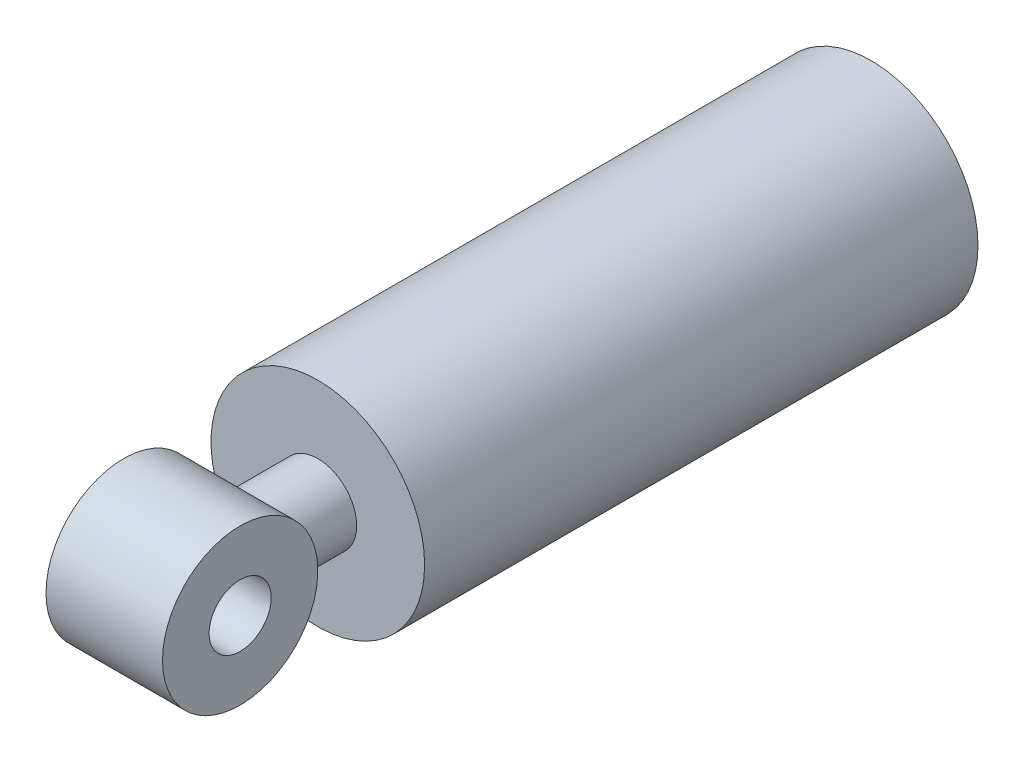
ISO-10303-21;
HEADER;
FILE_DESCRIPTION(('STEP AP214'),'2;1');
FILE_NAME('part.step','',(''),(''),'','','');
FILE_SCHEMA(('AUTOMOTIVE_DESIGN { 1 0 10303 214 1 1 1 1 }'));
ENDSEC;
DATA;
#1=APPLICATION_CONTEXT('core data for automotive mechanical design processes');
#2=APPLICATION_PROTOCOL_DEFINITION('international standard','automotive_design',2000,#1);
#3=PRODUCT_CONTEXT('',#1,'mechanical');
#4=PRODUCT('Part','Part','',(#3));
#5=PRODUCT_RELATED_PRODUCT_CATEGORY('part','',(#4));
#6=PRODUCT_DEFINITION_FORMATION('','',#4);
#7=PRODUCT_DEFINITION_CONTEXT('part definition',#1,'design');
#8=PRODUCT_DEFINITION('design','',#6,#7);
#9=PRODUCT_DEFINITION_SHAPE('','',#8);
#10=(LENGTH_UNIT() NAMED_UNIT(*) SI_UNIT(.MILLI.,.METRE.));
#11=(NAMED_UNIT(*) PLANE_ANGLE_UNIT() SI_UNIT($,.RADIAN.));
#12=(NAMED_UNIT(*) SI_UNIT($,.STERADIAN.) SOLID_ANGLE_UNIT());
#13=UNCERTAINTY_MEASURE_WITH_UNIT(LENGTH_MEASURE(1.E-05),#10,'distance_accuracy_value','');
#14=(GEOMETRIC_REPRESENTATION_CONTEXT(3) GLOBAL_UNCERTAINTY_ASSIGNED_CONTEXT((#13)) GLOBAL_UNIT_ASSIGNED_CONTEXT((#10,
#11,#12)) REPRESENTATION_CONTEXT('',''));
#15=CARTESIAN_POINT('',(0.,0.,0.));
#16=DIRECTION('',(0.,0.,1.));
#17=DIRECTION('',(1.,0.,0.));
#18=AXIS2_PLACEMENT_3D('',#15,#16,#17);
#19=CARTESIAN_POINT('',(0.,0.,-10.123));
#20=DIRECTION('',(0.,0.,-1.));
#21=DIRECTION('',(1.,0.,0.));
#22=AXIS2_PLACEMENT_3D('',#19,#20,#21);
#23=CYLINDRICAL_SURFACE('',#22,2.);
#24=CARTESIAN_POINT('',(0.,0.,-7.));
#25=DIRECTION('',(0.,0.,1.));
#26=DIRECTION('',(1.,0.,0.));
#27=AXIS2_PLACEMENT_3D('',#24,#25,#26);
#28=CIRCLE('',#27,2.);
#29=CARTESIAN_POINT('',(2.,0.,-7.));
#30=VERTEX_POINT('',#29);
#31=EDGE_CURVE('E10',#30,#30,#28,.T.);
#32=ORIENTED_EDGE('',*,*,#31,.T.);
#33=EDGE_LOOP('',(#32));
#34=FACE_BOUND('',#33,.T.);
#35=CARTESIAN_POINT('',(2.,0.,-4.));
#36=CARTESIAN_POINT('',(1.99999339536562,0.105143925902467,-3.99999426810082));
#37=CARTESIAN_POINT('',(1.99165985375789,0.210413199395125,-3.99580982039513));
#38=CARTESIAN_POINT('',(1.95869423931692,0.417840470537792,-3.97948312074314));
#39=CARTESIAN_POINT('',(1.93403121400437,0.519992173427259,-3.96732575657839));
#40=CARTESIAN_POINT('',(1.86961238276674,0.717867089760898,-3.93632558806751));
#41=CARTESIAN_POINT('',(1.82991523150406,0.813613605878292,-3.91750878355075));
#42=CARTESIAN_POINT('',(1.73685875727003,0.996945233613197,-3.87491553031523));
#43=CARTESIAN_POINT('',(1.68350051150227,1.08453098798012,-3.8511394726705));
#44=CARTESIAN_POINT('',(1.56096550102943,1.25501563552382,-3.79912516516124));
#45=CARTESIAN_POINT('',(1.49102704152072,1.33731042224422,-3.77070398255074));
#46=CARTESIAN_POINT('',(1.33895704150593,1.48955888973396,-3.71319940493486));
#47=CARTESIAN_POINT('',(1.25681629645512,1.55950316621353,-3.68411552418069));
#48=CARTESIAN_POINT('',(1.07503330095324,1.69050400090056,-3.62597902394695));
#49=CARTESIAN_POINT('',(0.974527803308175,1.75045067110327,-3.59710373940264));
#50=CARTESIAN_POINT('',(0.763265328027571,1.85233645378139,-3.54571957544641));
#51=CARTESIAN_POINT('',(0.652515742554502,1.89428842993267,-3.52320615213979));
#52=CARTESIAN_POINT('',(0.430669789156155,1.95626488437718,-3.48915734075617));
#53=CARTESIAN_POINT('',(0.319991095865212,1.97745171416088,-3.47704543167427));
#54=CARTESIAN_POINT('',(0.0960423244410466,2.00085398661769,-3.46363779897055));
#55=CARTESIAN_POINT('',(-0.0172250817423092,2.00308817674615,-3.46233138686576));
#56=CARTESIAN_POINT('',(-0.228572048630736,1.98937457434459,-3.47021860514497));
#57=CARTESIAN_POINT('',(-0.3268480624461,1.97556911907364,-3.47817527324027));
#58=CARTESIAN_POINT('',(-0.519443818746084,1.93387969811386,-3.50152457467701));
#59=CARTESIAN_POINT('',(-0.613762290610631,1.9059912477953,-3.51691957663553));
#60=CARTESIAN_POINT('',(-0.798458265131318,1.83641956077201,-3.55374952825482));
#61=CARTESIAN_POINT('',(-0.888692797571577,1.79443013423199,-3.57531681327997));
#62=CARTESIAN_POINT('',(-1.06126858518002,1.698083375336,-3.62206808562807));
#63=CARTESIAN_POINT('',(-1.14360627120018,1.64372048762493,-3.64725369560381));
#64=CARTESIAN_POINT('',(-1.30904250548645,1.51613210982558,-3.70226315806572));
#65=CARTESIAN_POINT('',(-1.39091374715231,1.44138891673856,-3.73227020473492));
#66=CARTESIAN_POINT('',(-1.5414708371818,1.27911115748275,-3.79095246600814));
#67=CARTESIAN_POINT('',(-1.61015038406777,1.19157051314857,-3.81962703917602));
#68=CARTESIAN_POINT('',(-1.73537132205945,1.0010330116637,-3.87403974565928));
#69=CARTESIAN_POINT('',(-1.79120094489148,0.897507183198818,-3.89957968324015));
#70=CARTESIAN_POINT('',(-1.88419405808602,0.680932430977594,-3.94315762242485));
#71=CARTESIAN_POINT('',(-1.92137237003033,0.567891152530552,-3.96120157887106));
#72=CARTESIAN_POINT('',(-1.97295080743335,0.345532983321405,-3.98648667482871));
#73=CARTESIAN_POINT('',(-1.98898247149356,0.236683061096652,-3.9944987660262));
#74=CARTESIAN_POINT('',(-2.00292946226897,0.0175591998987033,-4.00146026918207));
#75=CARTESIAN_POINT('',(-2.00085337127894,-0.0927140397398172,-4.00041397442637));
#76=CARTESIAN_POINT('',(-1.97958662316251,-0.302465943971974,-3.9898238450687));
#77=CARTESIAN_POINT('',(-1.96173493454001,-0.40211881609986,-3.98094491376337));
#78=CARTESIAN_POINT('',(-1.91152385620976,-0.596813784603882,-3.9564434262968));
#79=CARTESIAN_POINT('',(-1.87916286709301,-0.691855371382174,-3.94082012668824));
#80=CARTESIAN_POINT('',(-1.80000306713393,-0.877777216899145,-3.90368502827176));
#81=CARTESIAN_POINT('',(-1.75281789976743,-0.968460794011607,-3.88201763539261));
#82=CARTESIAN_POINT('',(-1.64578492870686,-1.14092272339854,-3.83487948634835));
#83=CARTESIAN_POINT('',(-1.58593173080921,-1.22269725955318,-3.80940711133877));
#84=CARTESIAN_POINT('',(-1.44847914933857,-1.38353537857843,-3.75416442672396));
#85=CARTESIAN_POINT('',(-1.36971426310971,-1.46154415563805,-3.72421769686998));
#86=CARTESIAN_POINT('',(-1.20014969744454,-1.60371264223771,-3.6652478321764));
#87=CARTESIAN_POINT('',(-1.10934176230416,-1.66786277142375,-3.63622534800094));
#88=CARTESIAN_POINT('',(-0.912712691654048,-1.78341582895804,-3.58102384412979));
#89=CARTESIAN_POINT('',(-0.806377467811037,-1.8340509916005,-3.55505059178121));
#90=CARTESIAN_POINT('',(-0.584979864850068,-1.91616565186941,-3.51148144588269));
#91=CARTESIAN_POINT('',(-0.469928947066219,-1.94766983173403,-3.493874764435));
#92=CARTESIAN_POINT('',(-0.246179554230592,-1.98772337493374,-3.47123002051604));
#93=CARTESIAN_POINT('',(-0.137931493129517,-1.9981859928109,-3.4651476693013));
#94=CARTESIAN_POINT('',(0.0788941343290494,-2.0013783087524,-3.46330709283206));
#95=CARTESIAN_POINT('',(0.187471537475723,-1.99411569324648,-3.4675443925278));
#96=CARTESIAN_POINT('',(0.390967003066874,-1.96385225118662,-3.48475724102153));
#97=CARTESIAN_POINT('',(0.486200940289479,-1.94241662868607,-3.49686188965317));
#98=CARTESIAN_POINT('',(0.671616238848733,-1.88635071644882,-3.52742032375305));
#99=CARTESIAN_POINT('',(0.761795964184063,-1.85171618231984,-3.54587615139337));
#100=CARTESIAN_POINT('',(0.941249701973074,-1.76763149060113,-3.58857060729071));
#101=CARTESIAN_POINT('',(1.03005580365806,-1.7173422756314,-3.61311444791841));
#102=CARTESIAN_POINT('',(1.19854907236252,-1.60430194327478,-3.66470663269721));
#103=CARTESIAN_POINT('',(1.27823146104222,-1.54154434248312,-3.69175627591221));
#104=CARTESIAN_POINT('',(1.43628396470935,-1.39640665332275,-3.74924646316184));
#105=CARTESIAN_POINT('',(1.51331820470058,-1.31256884599452,-3.77969966613256));
#106=CARTESIAN_POINT('',(1.65252596687054,-1.13230961246639,-3.83755504519861));
#107=CARTESIAN_POINT('',(1.71469147893981,-1.03588144661039,-3.8649555725239));
#108=CARTESIAN_POINT('',(1.82247272542414,-0.831863193565891,-3.91396019133075));
#109=CARTESIAN_POINT('',(1.86796833847294,-0.72419900755346,-3.93552192987866));
#110=CARTESIAN_POINT('',(1.93961633551482,-0.501484202276172,-3.97002682597974));
#111=CARTESIAN_POINT('',(1.96582369361143,-0.3864555991782,-3.98299446726136));
#112=CARTESIAN_POINT('',(1.98779482217148,-0.22520389298179,-3.99390923826956));
#113=CARTESIAN_POINT('',(1.99236528173268,-0.18032375888313,-3.99618730680502));
#114=CARTESIAN_POINT('',(1.99846933102817,-0.0903034636101831,-3.99923393953631));
#115=CARTESIAN_POINT('',(2.00000283694042,-0.0451632952932568,-4.00000246206762));
#116=CARTESIAN_POINT('',(2.,0.,-4.));
#117=B_SPLINE_CURVE_WITH_KNOTS('',3,(#35,#36,#37,#38,#39,#40,#41,#42,#43,#44,#45,#46,#47,#48,
#49,#50,#51,#52,#53,#54,#55,#56,#57,#58,#59,#60,#61,#62,#63,#64,#65,#66,#67,#68,#69,#70,#71,#72,
#73,#74,#75,#76,#77,#78,#79,#80,#81,#82,#83,#84,#85,#86,#87,#88,#89,#90,#91,#92,#93,#94,#95,#96,
#97,#98,#99,#100,#101,#102,#103,#104,#105,#106,#107,#108,#109,#110,#111,#112,#113,#114,#115,
#116),.UNSPECIFIED.,.T.,.F.,(4,2,2,2,2,2,2,2,2,2,2,2,2,2,2,2,2,2,2,2,2,2,2,2,2,2,2,2,2,2,2,2,2,
2,2,2,2,2,2,2,4),(0.,0.315248514840585,0.631096299418395,0.945724310984597,1.26032752116314,
1.59396351743618,1.92785247530807,2.28763452861505,2.64715895796562,2.98516024280459,
3.32282714658041,3.62011424818641,3.91749607851357,4.22180480336975,4.52625042520444,
4.86929882667757,5.21251069197373,5.57166044428881,5.93052433824559,6.25966580942691,
6.58865129022952,6.89213813012244,7.19565843261863,7.50785712055797,7.82018901496679,
8.16319221288838,8.50643177230864,8.86629364323452,9.22569023890902,9.55058615006093,
9.87534119729357,10.1691586049771,10.463070575767,10.7767291356057,11.0905512228726,
11.4425048551434,11.7946476676249,12.1492802732705,12.502898172423,12.6383056026783,
12.7737167702213),.UNSPECIFIED.);
#118=CARTESIAN_POINT('',(2.,0.,-4.));
#119=VERTEX_POINT('',#118);
#120=EDGE_CURVE('E43',#119,#119,#117,.T.);
#121=ORIENTED_EDGE('',*,*,#120,.F.);
#122=EDGE_LOOP('',(#121));
#123=FACE_BOUND('',#122,.T.);
#124=ADVANCED_FACE('F39',(#34,#123),#23,.T.);
#125=CARTESIAN_POINT('',(2.,0.,-7.));
#126=DIRECTION('',(0.,0.,1.));
#127=DIRECTION('',(-1.,0.,0.));
#128=AXIS2_PLACEMENT_3D('',#125,#126,#127);
#129=PLANE('',#128);
#130=ORIENTED_EDGE('',*,*,#31,.F.);
#131=EDGE_LOOP('',(#130));
#132=FACE_BOUND('',#131,.T.);
#133=CARTESIAN_POINT('',(0.,0.,-7.));
#134=DIRECTION('',(0.,0.,1.));
#135=DIRECTION('',(1.,0.,0.));
#136=AXIS2_PLACEMENT_3D('',#133,#134,#135);
#137=CIRCLE('',#136,5.5);
#138=CARTESIAN_POINT('',(5.5,0.,-7.));
#139=VERTEX_POINT('',#138);
#140=EDGE_CURVE('E51',#139,#139,#137,.T.);
#141=ORIENTED_EDGE('',*,*,#140,.T.);
#142=EDGE_LOOP('',(#141));
#143=FACE_BOUND('',#142,.T.);
#144=ADVANCED_FACE('F106',(#132,#143),#129,.T.);
#145=CARTESIAN_POINT('',(0.,0.,-10.123));
#146=DIRECTION('',(0.,0.,-1.));
#147=DIRECTION('',(1.,0.,0.));
#148=AXIS2_PLACEMENT_3D('',#145,#146,#147);
#149=CYLINDRICAL_SURFACE('',#148,5.5);
#150=ORIENTED_EDGE('',*,*,#140,.F.);
#151=EDGE_LOOP('',(#150));
#152=FACE_BOUND('',#151,.T.);
#153=CARTESIAN_POINT('',(0.,0.,-35.5));
#154=DIRECTION('',(0.,0.,1.));
#155=DIRECTION('',(1.,0.,0.));
#156=AXIS2_PLACEMENT_3D('',#153,#154,#155);
#157=CIRCLE('',#156,5.5);
#158=CARTESIAN_POINT('',(5.5,0.,-35.5));
#159=VERTEX_POINT('',#158);
#160=EDGE_CURVE('E55',#159,#159,#157,.T.);
#161=ORIENTED_EDGE('',*,*,#160,.T.);
#162=EDGE_LOOP('',(#161));
#163=FACE_BOUND('',#162,.T.);
#164=ADVANCED_FACE('F110',(#152,#163),#149,.T.);
#165=CARTESIAN_POINT('',(5.5,0.,-35.5));
#166=DIRECTION('',(0.,0.,-1.));
#167=DIRECTION('',(1.,0.,0.));
#168=AXIS2_PLACEMENT_3D('',#165,#166,#167);
#169=PLANE('',#168);
#170=ORIENTED_EDGE('',*,*,#160,.F.);
#171=EDGE_LOOP('',(#170));
#172=FACE_BOUND('',#171,.T.);
#173=CARTESIAN_POINT('',(0.,0.,-35.5));
#174=DIRECTION('',(0.,0.,1.));
#175=DIRECTION('',(1.,0.,0.));
#176=AXIS2_PLACEMENT_3D('',#173,#174,#175);
#177=CIRCLE('',#176,2.2);
#178=CARTESIAN_POINT('',(2.2,0.,-35.5));
#179=VERTEX_POINT('',#178);
#180=EDGE_CURVE('E60',#179,#179,#177,.T.);
#181=ORIENTED_EDGE('',*,*,#180,.T.);
#182=EDGE_LOOP('',(#181));
#183=FACE_BOUND('',#182,.T.);
#184=ADVANCED_FACE('F117',(#172,#183),#169,.T.);
#185=CARTESIAN_POINT('',(0.,0.,-10.123));
#186=DIRECTION('',(0.,0.,-1.));
#187=DIRECTION('',(1.,0.,0.));
#188=AXIS2_PLACEMENT_3D('',#185,#186,#187);
#189=CYLINDRICAL_SURFACE('',#188,2.2);
#190=ORIENTED_EDGE('',*,*,#180,.F.);
#191=EDGE_LOOP('',(#190));
#192=FACE_BOUND('',#191,.T.);
#193=CARTESIAN_POINT('',(0.,0.,-12.));
#194=DIRECTION('',(0.,0.,1.));
#195=DIRECTION('',(1.,0.,0.));
#196=AXIS2_PLACEMENT_3D('',#193,#194,#195);
#197=CIRCLE('',#196,2.2);
#198=CARTESIAN_POINT('',(2.2,0.,-12.));
#199=VERTEX_POINT('',#198);
#200=EDGE_CURVE('E63',#199,#199,#197,.T.);
#201=ORIENTED_EDGE('',*,*,#200,.T.);
#202=EDGE_LOOP('',(#201));
#203=FACE_BOUND('',#202,.T.);
#204=ADVANCED_FACE('F99',(#192,#203),#189,.F.);
#205=CARTESIAN_POINT('',(2.2,0.,-12.));
#206=DIRECTION('',(0.,0.,-1.));
#207=DIRECTION('',(1.,0.,0.));
#208=AXIS2_PLACEMENT_3D('',#205,#206,#207);
#209=PLANE('',#208);
#210=ORIENTED_EDGE('',*,*,#200,.F.);
#211=EDGE_LOOP('',(#210));
#212=FACE_BOUND('',#211,.T.);
#213=ADVANCED_FACE('F91',(#212),#209,.T.);
#214=CARTESIAN_POINT('',(3.,0.,0.));
#215=DIRECTION('',(-1.,0.,0.));
#216=DIRECTION('',(0.,0.,-1.));
#217=AXIS2_PLACEMENT_3D('',#214,#215,#216);
#218=CYLINDRICAL_SURFACE('',#217,4.);
#219=ORIENTED_EDGE('',*,*,#120,.T.);
#220=EDGE_LOOP('',(#219));
#221=FACE_BOUND('',#220,.T.);
#222=CARTESIAN_POINT('',(3.,0.,0.));
#223=DIRECTION('',(-1.,0.,0.));
#224=DIRECTION('',(0.,0.,1.));
#225=AXIS2_PLACEMENT_3D('',#222,#223,#224);
#226=CIRCLE('',#225,4.);
#227=CARTESIAN_POINT('',(3.,0.,4.));
#228=VERTEX_POINT('',#227);
#229=EDGE_CURVE('E69',#228,#228,#226,.T.);
#230=ORIENTED_EDGE('',*,*,#229,.T.);
#231=EDGE_LOOP('',(#230));
#232=FACE_BOUND('',#231,.T.);
#233=CARTESIAN_POINT('',(-3.,0.,0.));
#234=DIRECTION('',(-1.,0.,0.));
#235=DIRECTION('',(0.,0.,1.));
#236=AXIS2_PLACEMENT_3D('',#233,#234,#235);
#237=CIRCLE('',#236,4.);
#238=CARTESIAN_POINT('',(-3.,0.,4.));
#239=VERTEX_POINT('',#238);
#240=EDGE_CURVE('E66',#239,#239,#237,.T.);
#241=ORIENTED_EDGE('',*,*,#240,.F.);
#242=EDGE_LOOP('',(#241));
#243=FACE_BOUND('',#242,.T.);
#244=ADVANCED_FACE('F89',(#221,#232,#243),#218,.T.);
#245=CARTESIAN_POINT('',(3.,0.,0.));
#246=DIRECTION('',(1.,0.,0.));
#247=DIRECTION('',(0.,0.,1.));
#248=AXIS2_PLACEMENT_3D('',#245,#246,#247);
#249=PLANE('',#248);
#250=CARTESIAN_POINT('',(3.,0.,0.));
#251=DIRECTION('',(-1.,0.,0.));
#252=DIRECTION('',(0.,0.,1.));
#253=AXIS2_PLACEMENT_3D('',#250,#251,#252);
#254=CIRCLE('',#253,1.6);
#255=CARTESIAN_POINT('',(3.,0.,1.6));
#256=VERTEX_POINT('',#255);
#257=EDGE_CURVE('E73',#256,#256,#254,.T.);
#258=ORIENTED_EDGE('',*,*,#257,.T.);
#259=EDGE_LOOP('',(#258));
#260=FACE_BOUND('',#259,.T.);
#261=ORIENTED_EDGE('',*,*,#229,.F.);
#262=EDGE_LOOP('',(#261));
#263=FACE_BOUND('',#262,.T.);
#264=ADVANCED_FACE('F85',(#260,#263),#249,.T.);
#265=CARTESIAN_POINT('',(-3.,0.,0.));
#266=DIRECTION('',(1.,0.,0.));
#267=DIRECTION('',(0.,0.,1.));
#268=AXIS2_PLACEMENT_3D('',#265,#266,#267);
#269=PLANE('',#268);
#270=CARTESIAN_POINT('',(-3.,0.,0.));
#271=DIRECTION('',(-1.,0.,0.));
#272=DIRECTION('',(0.,0.,1.));
#273=AXIS2_PLACEMENT_3D('',#270,#271,#272);
#274=CIRCLE('',#273,1.6);
#275=CARTESIAN_POINT('',(-3.,0.,1.6));
#276=VERTEX_POINT('',#275);
#277=EDGE_CURVE('E70',#276,#276,#274,.T.);
#278=ORIENTED_EDGE('',*,*,#277,.F.);
#279=EDGE_LOOP('',(#278));
#280=FACE_BOUND('',#279,.T.);
#281=ORIENTED_EDGE('',*,*,#240,.T.);
#282=EDGE_LOOP('',(#281));
#283=FACE_BOUND('',#282,.T.);
#284=ADVANCED_FACE('F82',(#280,#283),#269,.F.);
#285=CARTESIAN_POINT('',(-3.,0.,0.));
#286=DIRECTION('',(1.,0.,0.));
#287=DIRECTION('',(0.,0.,1.));
#288=AXIS2_PLACEMENT_3D('',#285,#286,#287);
#289=CYLINDRICAL_SURFACE('',#288,1.6);
#290=ORIENTED_EDGE('',*,*,#277,.T.);
#291=EDGE_LOOP('',(#290));
#292=FACE_BOUND('',#291,.T.);
#293=ORIENTED_EDGE('',*,*,#257,.F.);
#294=EDGE_LOOP('',(#293));
#295=FACE_BOUND('',#294,.T.);
#296=ADVANCED_FACE('F79',(#292,#295),#289,.F.);
#297=CLOSED_SHELL('',(#124,#144,#164,#184,#204,#213,#244,#264,#284,#296));
#298=MANIFOLD_SOLID_BREP('B2',#297);
#299=ADVANCED_BREP_SHAPE_REPRESENTATION('',(#18,#298),#14);
#300=SHAPE_DEFINITION_REPRESENTATION(#9,#299);
ENDSEC;
END-ISO-10303-21;
